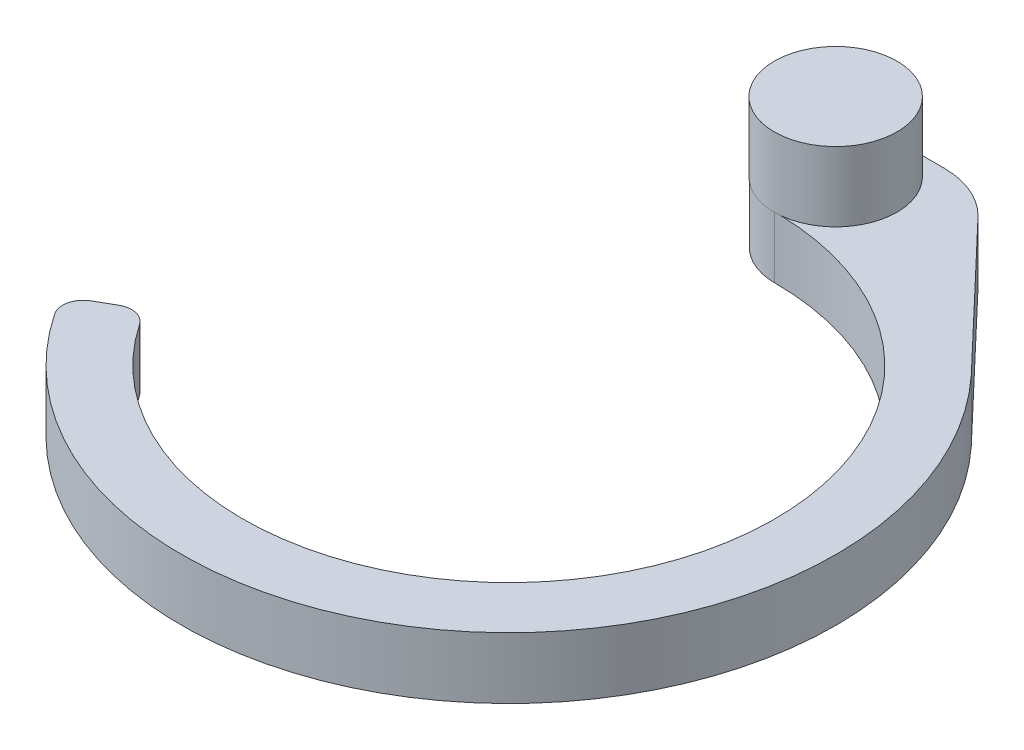
ISO-10303-21;
HEADER;
FILE_DESCRIPTION(('STEP AP214'),'2;1');
FILE_NAME('part.step','',(''),(''),'','','');
FILE_SCHEMA(('AUTOMOTIVE_DESIGN { 1 0 10303 214 1 1 1 1 }'));
ENDSEC;
DATA;
#1=APPLICATION_CONTEXT('core data for automotive mechanical design processes');
#2=APPLICATION_PROTOCOL_DEFINITION('international standard','automotive_design',2000,#1);
#3=PRODUCT_CONTEXT('',#1,'mechanical');
#4=PRODUCT('Part','Part','',(#3));
#5=PRODUCT_RELATED_PRODUCT_CATEGORY('part','',(#4));
#6=PRODUCT_DEFINITION_FORMATION('','',#4);
#7=PRODUCT_DEFINITION_CONTEXT('part definition',#1,'design');
#8=PRODUCT_DEFINITION('design','',#6,#7);
#9=PRODUCT_DEFINITION_SHAPE('','',#8);
#10=(LENGTH_UNIT() NAMED_UNIT(*) SI_UNIT(.MILLI.,.METRE.));
#11=(NAMED_UNIT(*) PLANE_ANGLE_UNIT() SI_UNIT($,.RADIAN.));
#12=(NAMED_UNIT(*) SI_UNIT($,.STERADIAN.) SOLID_ANGLE_UNIT());
#13=UNCERTAINTY_MEASURE_WITH_UNIT(LENGTH_MEASURE(1.E-05),#10,'distance_accuracy_value','');
#14=(GEOMETRIC_REPRESENTATION_CONTEXT(3) GLOBAL_UNCERTAINTY_ASSIGNED_CONTEXT((#13)) GLOBAL_UNIT_ASSIGNED_CONTEXT((#10,
#11,#12)) REPRESENTATION_CONTEXT('',''));
#15=CARTESIAN_POINT('',(0.,0.,0.));
#16=DIRECTION('',(0.,0.,1.));
#17=DIRECTION('',(1.,0.,0.));
#18=AXIS2_PLACEMENT_3D('',#15,#16,#17);
#19=CARTESIAN_POINT('',(-62.3074069840787,15.,41.7467008866615));
#20=DIRECTION('',(0.,-1.,0.));
#21=DIRECTION('',(0.,0.,-1.));
#22=AXIS2_PLACEMENT_3D('',#19,#20,#21);
#23=CYLINDRICAL_SURFACE('',#22,5.00000000000001);
#24=CARTESIAN_POINT('',(-62.3074069840787,0.,41.7467008866615));
#25=DIRECTION('',(0.,1.,0.));
#26=DIRECTION('',(0.,0.,1.));
#27=AXIS2_PLACEMENT_3D('',#24,#25,#26);
#28=CIRCLE('',#27,5.00000000000001);
#29=CARTESIAN_POINT('',(-66.4612341163506,0.,44.5298142791056));
#30=VERTEX_POINT('',#29);
#31=CARTESIAN_POINT('',(-64.8074069840787,0.,37.4165738677393));
#32=VERTEX_POINT('',#31);
#33=EDGE_CURVE('E139',#30,#32,#28,.F.);
#34=ORIENTED_EDGE('',*,*,#33,.F.);
#35=DIRECTION('',(0.,-1.,0.));
#36=VECTOR('',#35,1.);
#37=CARTESIAN_POINT('',(-66.4612341163506,15.,44.5298142791056));
#38=LINE('',#37,#36);
#39=CARTESIAN_POINT('',(-66.4612341163506,15.,44.5298142791056));
#40=VERTEX_POINT('',#39);
#41=EDGE_CURVE('E11',#40,#30,#38,.T.);
#42=ORIENTED_EDGE('',*,*,#41,.F.);
#43=CARTESIAN_POINT('',(-62.3074069840787,15.,41.7467008866615));
#44=DIRECTION('',(0.,1.,0.));
#45=DIRECTION('',(0.,0.,1.));
#46=AXIS2_PLACEMENT_3D('',#43,#44,#45);
#47=CIRCLE('',#46,5.00000000000001);
#48=CARTESIAN_POINT('',(-64.8074069840787,15.,37.4165738677393));
#49=VERTEX_POINT('',#48);
#50=EDGE_CURVE('E163',#40,#49,#47,.F.);
#51=ORIENTED_EDGE('',*,*,#50,.T.);
#52=DIRECTION('',(0.,-1.,0.));
#53=VECTOR('',#52,1.);
#54=CARTESIAN_POINT('',(-64.8074069840787,15.,37.4165738677393));
#55=LINE('',#54,#53);
#56=EDGE_CURVE('E90',#49,#32,#55,.T.);
#57=ORIENTED_EDGE('',*,*,#56,.T.);
#58=EDGE_LOOP('',(#34,#42,#51,#57));
#59=FACE_BOUND('',#58,.T.);
#60=ADVANCED_FACE('F33',(#59),#23,.T.);
#61=CARTESIAN_POINT('',(0.,15.,0.));
#62=DIRECTION('',(0.,-1.,0.));
#63=DIRECTION('',(0.,0.,-1.));
#64=AXIS2_PLACEMENT_3D('',#61,#62,#63);
#65=CYLINDRICAL_SURFACE('',#64,80.);
#66=CARTESIAN_POINT('',(0.,0.,0.));
#67=DIRECTION('',(0.,1.,0.));
#68=DIRECTION('',(0.,0.,1.));
#69=AXIS2_PLACEMENT_3D('',#66,#67,#68);
#70=CIRCLE('',#69,80.);
#71=CARTESIAN_POINT('',(58.5757297296054,0.,-54.4874654085159));
#72=VERTEX_POINT('',#71);
#73=EDGE_CURVE('E142',#30,#72,#70,.T.);
#74=ORIENTED_EDGE('',*,*,#73,.T.);
#75=DIRECTION('',(0.,-1.,0.));
#76=VECTOR('',#75,1.);
#77=CARTESIAN_POINT('',(58.5757297296054,15.,-54.4874654085159));
#78=LINE('',#77,#76);
#79=CARTESIAN_POINT('',(58.5757297296054,15.,-54.4874654085159));
#80=VERTEX_POINT('',#79);
#81=EDGE_CURVE('E40',#80,#72,#78,.T.);
#82=ORIENTED_EDGE('',*,*,#81,.F.);
#83=CARTESIAN_POINT('',(0.,15.,0.));
#84=DIRECTION('',(0.,1.,0.));
#85=DIRECTION('',(0.,0.,1.));
#86=AXIS2_PLACEMENT_3D('',#83,#84,#85);
#87=CIRCLE('',#86,80.);
#88=EDGE_CURVE('E194',#40,#80,#87,.T.);
#89=ORIENTED_EDGE('',*,*,#88,.F.);
#90=ORIENTED_EDGE('',*,*,#41,.T.);
#91=EDGE_LOOP('',(#74,#82,#89,#90));
#92=FACE_BOUND('',#91,.T.);
#93=ADVANCED_FACE('F181',(#92),#65,.T.);
#94=CARTESIAN_POINT('',(57.9325504327501,15.,-55.1629373618664));
#95=DIRECTION('',(0.724206102182212,0.,-0.689583585623996));
#96=DIRECTION('',(-0.689583585623996,0.,-0.724206102182212));
#97=AXIS2_PLACEMENT_3D('',#94,#95,#96);
#98=PLANE('',#97);
#99=DIRECTION('',(0.689583585623996,0.,0.724206102182212));
#100=VECTOR('',#99,1.);
#101=CARTESIAN_POINT('',(57.9325504327501,0.,-55.1629373618664));
#102=LINE('',#101,#100);
#103=CARTESIAN_POINT('',(25.911523347206,0.,-88.7916717124799));
#104=VERTEX_POINT('',#103);
#105=EDGE_CURVE('E146',#104,#72,#102,.T.);
#106=ORIENTED_EDGE('',*,*,#105,.F.);
#107=DIRECTION('',(0.,-1.,0.));
#108=VECTOR('',#107,1.);
#109=CARTESIAN_POINT('',(25.911523347206,15.,-88.7916717124799));
#110=LINE('',#109,#108);
#111=CARTESIAN_POINT('',(25.911523347206,15.,-88.7916717124799));
#112=VERTEX_POINT('',#111);
#113=EDGE_CURVE('E171',#112,#104,#110,.T.);
#114=ORIENTED_EDGE('',*,*,#113,.F.);
#115=DIRECTION('',(0.689583585623996,0.,0.724206102182212));
#116=VECTOR('',#115,1.);
#117=CARTESIAN_POINT('',(57.9325504327501,15.,-55.1629373618664));
#118=LINE('',#117,#116);
#119=EDGE_CURVE('E178',#112,#80,#118,.T.);
#120=ORIENTED_EDGE('',*,*,#119,.T.);
#121=ORIENTED_EDGE('',*,*,#81,.T.);
#122=EDGE_LOOP('',(#106,#114,#120,#121));
#123=FACE_BOUND('',#122,.T.);
#124=ADVANCED_FACE('F176',(#123),#98,.T.);
#125=CARTESIAN_POINT('',(11.4274013035615,15.,-75.));
#126=DIRECTION('',(0.,-1.,0.));
#127=DIRECTION('',(0.,0.,-1.));
#128=AXIS2_PLACEMENT_3D('',#125,#126,#127);
#129=CYLINDRICAL_SURFACE('',#128,20.0000000000001);
#130=CARTESIAN_POINT('',(11.4274013035615,0.,-75.));
#131=DIRECTION('',(0.,1.,0.));
#132=DIRECTION('',(0.,0.,1.));
#133=AXIS2_PLACEMENT_3D('',#130,#131,#132);
#134=CIRCLE('',#133,20.0000000000001);
#135=CARTESIAN_POINT('',(11.4274013035618,0.,-95.));
#136=VERTEX_POINT('',#135);
#137=EDGE_CURVE('E149',#136,#104,#134,.F.);
#138=ORIENTED_EDGE('',*,*,#137,.F.);
#139=DIRECTION('',(0.,-1.,0.));
#140=VECTOR('',#139,1.);
#141=CARTESIAN_POINT('',(11.4274013035618,15.,-95.));
#142=LINE('',#141,#140);
#143=CARTESIAN_POINT('',(11.4274013035618,15.,-95.));
#144=VERTEX_POINT('',#143);
#145=EDGE_CURVE('E169',#144,#136,#142,.T.);
#146=ORIENTED_EDGE('',*,*,#145,.F.);
#147=CARTESIAN_POINT('',(11.4274013035615,15.,-75.));
#148=DIRECTION('',(0.,1.,0.));
#149=DIRECTION('',(0.,0.,1.));
#150=AXIS2_PLACEMENT_3D('',#147,#148,#149);
#151=CIRCLE('',#150,20.0000000000001);
#152=EDGE_CURVE('E191',#144,#112,#151,.F.);
#153=ORIENTED_EDGE('',*,*,#152,.T.);
#154=ORIENTED_EDGE('',*,*,#113,.T.);
#155=EDGE_LOOP('',(#138,#146,#153,#154));
#156=FACE_BOUND('',#155,.T.);
#157=ADVANCED_FACE('F188',(#156),#129,.T.);
#158=CARTESIAN_POINT('',(-1.15370923512719E-13,15.,-95.));
#159=DIRECTION('',(0.,0.,-1.));
#160=DIRECTION('',(-1.,0.,0.));
#161=AXIS2_PLACEMENT_3D('',#158,#159,#160);
#162=PLANE('',#161);
#163=DIRECTION('',(1.,0.,0.));
#164=VECTOR('',#163,1.);
#165=CARTESIAN_POINT('',(-1.15370923512719E-13,0.,-95.));
#166=LINE('',#165,#164);
#167=CARTESIAN_POINT('',(0.,0.,-95.));
#168=VERTEX_POINT('',#167);
#169=EDGE_CURVE('E152',#168,#136,#166,.T.);
#170=ORIENTED_EDGE('',*,*,#169,.F.);
#171=DIRECTION('',(0.,-1.,0.));
#172=VECTOR('',#171,1.);
#173=CARTESIAN_POINT('',(0.,15.,-95.));
#174=LINE('',#173,#172);
#175=CARTESIAN_POINT('',(0.,15.,-95.));
#176=VERTEX_POINT('',#175);
#177=EDGE_CURVE('E167',#176,#168,#174,.T.);
#178=ORIENTED_EDGE('',*,*,#177,.F.);
#179=DIRECTION('',(1.,0.,0.));
#180=VECTOR('',#179,1.);
#181=CARTESIAN_POINT('',(-1.15370923512719E-13,15.,-95.));
#182=LINE('',#181,#180);
#183=EDGE_CURVE('E196',#176,#144,#182,.T.);
#184=ORIENTED_EDGE('',*,*,#183,.T.);
#185=ORIENTED_EDGE('',*,*,#145,.T.);
#186=EDGE_LOOP('',(#170,#178,#184,#185));
#187=FACE_BOUND('',#186,.T.);
#188=ADVANCED_FACE('F229',(#187),#162,.T.);
#189=CARTESIAN_POINT('',(0.,15.,-80.));
#190=DIRECTION('',(0.,-1.,0.));
#191=DIRECTION('',(0.,0.,-1.));
#192=AXIS2_PLACEMENT_3D('',#189,#190,#191);
#193=CYLINDRICAL_SURFACE('',#192,15.);
#194=CARTESIAN_POINT('',(0.,0.,-80.));
#195=DIRECTION('',(0.,1.,0.));
#196=DIRECTION('',(0.,0.,1.));
#197=AXIS2_PLACEMENT_3D('',#194,#195,#196);
#198=CIRCLE('',#197,15.);
#199=CARTESIAN_POINT('',(0.,0.,-65.));
#200=VERTEX_POINT('',#199);
#201=EDGE_CURVE('E155',#168,#200,#198,.T.);
#202=ORIENTED_EDGE('',*,*,#201,.T.);
#203=DIRECTION('',(0.,-1.,0.));
#204=VECTOR('',#203,1.);
#205=CARTESIAN_POINT('',(0.,15.,-65.));
#206=LINE('',#205,#204);
#207=CARTESIAN_POINT('',(0.,15.,-65.));
#208=VERTEX_POINT('',#207);
#209=EDGE_CURVE('E123',#208,#200,#206,.T.);
#210=ORIENTED_EDGE('',*,*,#209,.F.);
#211=CARTESIAN_POINT('',(0.,15.,-80.));
#212=DIRECTION('',(0.,1.,0.));
#213=DIRECTION('',(0.,0.,1.));
#214=AXIS2_PLACEMENT_3D('',#211,#212,#213);
#215=CIRCLE('',#214,15.);
#216=CARTESIAN_POINT('',(-14.9999274475423,15.,-79.9533462920227));
#217=VERTEX_POINT('',#216);
#218=EDGE_CURVE('E200',#217,#208,#215,.T.);
#219=ORIENTED_EDGE('',*,*,#218,.F.);
#220=EDGE_CURVE('E134',#176,#217,#215,.T.);
#221=ORIENTED_EDGE('',*,*,#220,.F.);
#222=ORIENTED_EDGE('',*,*,#177,.T.);
#223=EDGE_LOOP('',(#202,#210,#219,#221,#222));
#224=FACE_BOUND('',#223,.T.);
#225=ADVANCED_FACE('F209',(#224),#193,.T.);
#226=CARTESIAN_POINT('',(0.,15.,0.));
#227=DIRECTION('',(0.,-1.,0.));
#228=DIRECTION('',(0.,0.,-1.));
#229=AXIS2_PLACEMENT_3D('',#226,#227,#228);
#230=CYLINDRICAL_SURFACE('',#229,65.);
#231=CARTESIAN_POINT('',(0.,0.,0.));
#232=DIRECTION('',(0.,1.,0.));
#233=DIRECTION('',(0.,0.,1.));
#234=AXIS2_PLACEMENT_3D('',#231,#232,#233);
#235=CIRCLE('',#234,65.);
#236=CARTESIAN_POINT('',(-53.8264378899364,0.,36.4378180477484));
#237=VERTEX_POINT('',#236);
#238=EDGE_CURVE('E120',#237,#200,#235,.T.);
#239=ORIENTED_EDGE('',*,*,#238,.F.);
#240=DIRECTION('',(0.,-1.,0.));
#241=VECTOR('',#240,1.);
#242=CARTESIAN_POINT('',(-53.8264378899364,15.,36.4378180477484));
#243=LINE('',#242,#241);
#244=CARTESIAN_POINT('',(-53.8264378899364,15.,36.4378180477484));
#245=VERTEX_POINT('',#244);
#246=EDGE_CURVE('E114',#245,#237,#243,.T.);
#247=ORIENTED_EDGE('',*,*,#246,.F.);
#248=CARTESIAN_POINT('',(0.,15.,0.));
#249=DIRECTION('',(0.,1.,0.));
#250=DIRECTION('',(0.,0.,1.));
#251=AXIS2_PLACEMENT_3D('',#248,#249,#250);
#252=CIRCLE('',#251,65.);
#253=CARTESIAN_POINT('',(1.50653146564037,15.,-64.9825389081024));
#254=VERTEX_POINT('',#253);
#255=EDGE_CURVE('E117',#245,#254,#252,.T.);
#256=ORIENTED_EDGE('',*,*,#255,.T.);
#257=EDGE_CURVE('E132',#254,#208,#252,.T.);
#258=ORIENTED_EDGE('',*,*,#257,.T.);
#259=ORIENTED_EDGE('',*,*,#209,.T.);
#260=EDGE_LOOP('',(#239,#247,#256,#258,#259));
#261=FACE_BOUND('',#260,.T.);
#262=ADVANCED_FACE('F116',(#261),#230,.F.);
#263=CARTESIAN_POINT('',(-57.9669331122392,15.,39.2407271283444));
#264=DIRECTION('',(0.,-1.,0.));
#265=DIRECTION('',(0.,0.,-1.));
#266=AXIS2_PLACEMENT_3D('',#263,#264,#265);
#267=CYLINDRICAL_SURFACE('',#266,5.);
#268=CARTESIAN_POINT('',(-57.9669331122392,0.,39.2407271283444));
#269=DIRECTION('',(0.,1.,0.));
#270=DIRECTION('',(0.,0.,1.));
#271=AXIS2_PLACEMENT_3D('',#268,#269,#270);
#272=CIRCLE('',#271,5.);
#273=CARTESIAN_POINT('',(-60.4669331122392,0.,34.9106001094222));
#274=VERTEX_POINT('',#273);
#275=EDGE_CURVE('E159',#237,#274,#272,.T.);
#276=ORIENTED_EDGE('',*,*,#275,.T.);
#277=DIRECTION('',(0.,-1.,0.));
#278=VECTOR('',#277,1.);
#279=CARTESIAN_POINT('',(-60.4669331122392,15.,34.9106001094222));
#280=LINE('',#279,#278);
#281=CARTESIAN_POINT('',(-60.4669331122392,15.,34.9106001094222));
#282=VERTEX_POINT('',#281);
#283=EDGE_CURVE('E124',#282,#274,#280,.T.);
#284=ORIENTED_EDGE('',*,*,#283,.F.);
#285=CARTESIAN_POINT('',(-57.9669331122392,15.,39.2407271283444));
#286=DIRECTION('',(0.,1.,0.));
#287=DIRECTION('',(0.,0.,1.));
#288=AXIS2_PLACEMENT_3D('',#285,#286,#287);
#289=CIRCLE('',#288,5.);
#290=EDGE_CURVE('E127',#245,#282,#289,.T.);
#291=ORIENTED_EDGE('',*,*,#290,.F.);
#292=ORIENTED_EDGE('',*,*,#246,.T.);
#293=EDGE_LOOP('',(#276,#284,#291,#292));
#294=FACE_BOUND('',#293,.T.);
#295=ADVANCED_FACE('F128',(#294),#267,.T.);
#296=CARTESIAN_POINT('',(0.,15.,0.));
#297=DIRECTION('',(0.499999999999997,0.,0.86602540378444));
#298=DIRECTION('',(0.86602540378444,0.,-0.499999999999997));
#299=AXIS2_PLACEMENT_3D('',#296,#297,#298);
#300=PLANE('',#299);
#301=DIRECTION('',(-0.86602540378444,0.,0.499999999999997));
#302=VECTOR('',#301,1.);
#303=CARTESIAN_POINT('',(0.,0.,0.));
#304=LINE('',#303,#302);
#305=EDGE_CURVE('E161',#274,#32,#304,.T.);
#306=ORIENTED_EDGE('',*,*,#305,.T.);
#307=ORIENTED_EDGE('',*,*,#56,.F.);
#308=DIRECTION('',(-0.86602540378444,0.,0.499999999999997));
#309=VECTOR('',#308,1.);
#310=CARTESIAN_POINT('',(0.,15.,0.));
#311=LINE('',#310,#309);
#312=EDGE_CURVE('E55',#282,#49,#311,.T.);
#313=ORIENTED_EDGE('',*,*,#312,.F.);
#314=ORIENTED_EDGE('',*,*,#283,.T.);
#315=EDGE_LOOP('',(#306,#307,#313,#314));
#316=FACE_BOUND('',#315,.T.);
#317=ADVANCED_FACE('F238',(#316),#300,.F.);
#318=CARTESIAN_POINT('',(0.,15.,0.));
#319=DIRECTION('',(0.,1.,0.));
#320=DIRECTION('',(0.,0.,1.));
#321=AXIS2_PLACEMENT_3D('',#318,#319,#320);
#322=PLANE('',#321);
#323=CARTESIAN_POINT('',(0.,15.,-79.906692584041));
#324=DIRECTION('',(0.,1.,0.));
#325=DIRECTION('',(0.,0.,1.));
#326=AXIS2_PLACEMENT_3D('',#323,#324,#325);
#327=CIRCLE('',#326,15.);
#328=EDGE_CURVE('E47',#254,#217,#327,.T.);
#329=ORIENTED_EDGE('',*,*,#328,.F.);
#330=ORIENTED_EDGE('',*,*,#255,.F.);
#331=ORIENTED_EDGE('',*,*,#290,.T.);
#332=ORIENTED_EDGE('',*,*,#312,.T.);
#333=ORIENTED_EDGE('',*,*,#50,.F.);
#334=ORIENTED_EDGE('',*,*,#88,.T.);
#335=ORIENTED_EDGE('',*,*,#119,.F.);
#336=ORIENTED_EDGE('',*,*,#152,.F.);
#337=ORIENTED_EDGE('',*,*,#183,.F.);
#338=ORIENTED_EDGE('',*,*,#220,.T.);
#339=EDGE_LOOP('',(#329,#330,#331,#332,#333,#334,#335,#336,#337,#338));
#340=FACE_BOUND('',#339,.T.);
#341=ADVANCED_FACE('F131',(#340),#322,.T.);
#342=CARTESIAN_POINT('',(0.,0.,0.));
#343=DIRECTION('',(0.,1.,0.));
#344=DIRECTION('',(0.,0.,1.));
#345=AXIS2_PLACEMENT_3D('',#342,#343,#344);
#346=PLANE('',#345);
#347=ORIENTED_EDGE('',*,*,#33,.T.);
#348=ORIENTED_EDGE('',*,*,#305,.F.);
#349=ORIENTED_EDGE('',*,*,#275,.F.);
#350=ORIENTED_EDGE('',*,*,#238,.T.);
#351=ORIENTED_EDGE('',*,*,#201,.F.);
#352=ORIENTED_EDGE('',*,*,#169,.T.);
#353=ORIENTED_EDGE('',*,*,#137,.T.);
#354=ORIENTED_EDGE('',*,*,#105,.T.);
#355=ORIENTED_EDGE('',*,*,#73,.F.);
#356=EDGE_LOOP('',(#347,#348,#349,#350,#351,#352,#353,#354,#355));
#357=FACE_BOUND('',#356,.T.);
#358=ADVANCED_FACE('F183',(#357),#346,.F.);
#359=CARTESIAN_POINT('',(0.,15.,-79.906692584041));
#360=DIRECTION('',(0.,1.,0.));
#361=DIRECTION('',(0.,0.,1.));
#362=AXIS2_PLACEMENT_3D('',#359,#360,#361);
#363=PLANE('',#362);
#364=EDGE_CURVE('E211',#217,#254,#327,.T.);
#365=ORIENTED_EDGE('',*,*,#364,.F.);
#366=ORIENTED_EDGE('',*,*,#218,.T.);
#367=ORIENTED_EDGE('',*,*,#257,.F.);
#368=EDGE_LOOP('',(#365,#366,#367));
#369=FACE_BOUND('',#368,.T.);
#370=ADVANCED_FACE('F212',(#369),#363,.F.);
#371=CARTESIAN_POINT('',(0.,32.,-79.906692584041));
#372=DIRECTION('',(0.,-1.,0.));
#373=DIRECTION('',(0.,0.,-1.));
#374=AXIS2_PLACEMENT_3D('',#371,#372,#373);
#375=CYLINDRICAL_SURFACE('',#374,15.);
#376=CARTESIAN_POINT('',(0.,32.,-79.906692584041));
#377=DIRECTION('',(0.,1.,0.));
#378=DIRECTION('',(0.,0.,1.));
#379=AXIS2_PLACEMENT_3D('',#376,#377,#378);
#380=CIRCLE('',#379,15.);
#381=CARTESIAN_POINT('',(0.,32.,-64.906692584041));
#382=VERTEX_POINT('',#381);
#383=EDGE_CURVE('E143',#382,#382,#380,.T.);
#384=ORIENTED_EDGE('',*,*,#383,.F.);
#385=EDGE_LOOP('',(#384));
#386=FACE_BOUND('',#385,.T.);
#387=ORIENTED_EDGE('',*,*,#328,.T.);
#388=ORIENTED_EDGE('',*,*,#364,.T.);
#389=EDGE_LOOP('',(#387,#388));
#390=FACE_BOUND('',#389,.T.);
#391=ADVANCED_FACE('F215',(#386,#390),#375,.T.);
#392=CARTESIAN_POINT('',(0.,32.,-79.906692584041));
#393=DIRECTION('',(0.,1.,0.));
#394=DIRECTION('',(0.,0.,1.));
#395=AXIS2_PLACEMENT_3D('',#392,#393,#394);
#396=PLANE('',#395);
#397=ORIENTED_EDGE('',*,*,#383,.T.);
#398=EDGE_LOOP('',(#397));
#399=FACE_BOUND('',#398,.T.);
#400=ADVANCED_FACE('F248',(#399),#396,.T.);
#401=CLOSED_SHELL('',(#60,#93,#124,#157,#188,#225,#262,#295,#317,#341,#358,#370,#391,#400));
#402=MANIFOLD_SOLID_BREP('B2',#401);
#403=ADVANCED_BREP_SHAPE_REPRESENTATION('',(#18,#402),#14);
#404=SHAPE_DEFINITION_REPRESENTATION(#9,#403);
ENDSEC;
END-ISO-10303-21;
